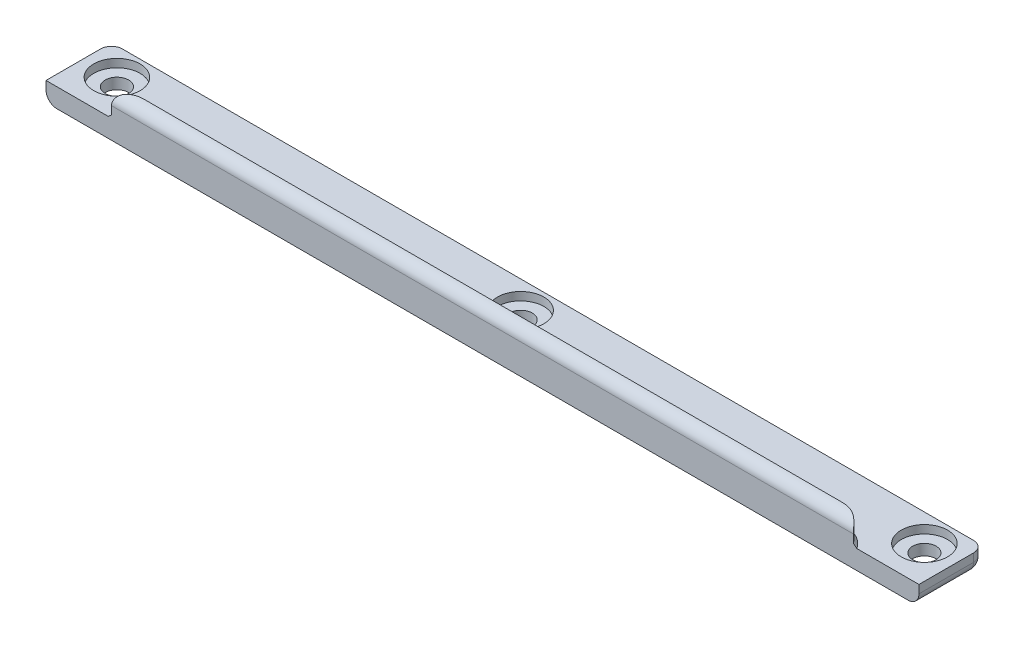
ISO-10303-21;
HEADER;
FILE_DESCRIPTION(('STEP AP214'),'2;1');
FILE_NAME('part.step','',(''),(''),'','','');
FILE_SCHEMA(('AUTOMOTIVE_DESIGN { 1 0 10303 214 1 1 1 1 }'));
ENDSEC;
DATA;
#1=APPLICATION_CONTEXT('core data for automotive mechanical design processes');
#2=APPLICATION_PROTOCOL_DEFINITION('international standard','automotive_design',2000,#1);
#3=PRODUCT_CONTEXT('',#1,'mechanical');
#4=PRODUCT('Part','Part','',(#3));
#5=PRODUCT_RELATED_PRODUCT_CATEGORY('part','',(#4));
#6=PRODUCT_DEFINITION_FORMATION('','',#4);
#7=PRODUCT_DEFINITION_CONTEXT('part definition',#1,'design');
#8=PRODUCT_DEFINITION('design','',#6,#7);
#9=PRODUCT_DEFINITION_SHAPE('','',#8);
#10=(LENGTH_UNIT() NAMED_UNIT(*) SI_UNIT(.MILLI.,.METRE.));
#11=(NAMED_UNIT(*) PLANE_ANGLE_UNIT() SI_UNIT($,.RADIAN.));
#12=(NAMED_UNIT(*) SI_UNIT($,.STERADIAN.) SOLID_ANGLE_UNIT());
#13=UNCERTAINTY_MEASURE_WITH_UNIT(LENGTH_MEASURE(1.E-05),#10,'distance_accuracy_value','');
#14=(GEOMETRIC_REPRESENTATION_CONTEXT(3) GLOBAL_UNCERTAINTY_ASSIGNED_CONTEXT((#13)) GLOBAL_UNIT_ASSIGNED_CONTEXT((#10,
#11,#12)) REPRESENTATION_CONTEXT('',''));
#15=CARTESIAN_POINT('',(0.,0.,0.));
#16=DIRECTION('',(0.,0.,1.));
#17=DIRECTION('',(1.,0.,0.));
#18=AXIS2_PLACEMENT_3D('',#15,#16,#17);
#19=CARTESIAN_POINT('',(0.,1.5,0.));
#20=DIRECTION('',(0.,-1.,0.));
#21=DIRECTION('',(0.,0.,-1.));
#22=AXIS2_PLACEMENT_3D('',#19,#20,#21);
#23=PLANE('',#22);
#24=DIRECTION('',(0.,0.,1.));
#25=VECTOR('',#24,1.);
#26=CARTESIAN_POINT('',(165.,1.5,5.));
#27=LINE('',#26,#25);
#28=CARTESIAN_POINT('',(165.,1.5,2.));
#29=VERTEX_POINT('',#28);
#30=CARTESIAN_POINT('',(165.,1.49999999999992,12.));
#31=VERTEX_POINT('',#30);
#32=EDGE_CURVE('E443',#29,#31,#27,.T.);
#33=ORIENTED_EDGE('',*,*,#32,.F.);
#34=CARTESIAN_POINT('',(163.,1.5,2.));
#35=DIRECTION('',(0.,-1.,0.));
#36=DIRECTION('',(0.,0.,-1.));
#37=AXIS2_PLACEMENT_3D('',#34,#35,#36);
#38=CIRCLE('',#37,2.);
#39=CARTESIAN_POINT('',(163.,1.5,0.));
#40=VERTEX_POINT('',#39);
#41=EDGE_CURVE('E12',#29,#40,#38,.F.);
#42=ORIENTED_EDGE('',*,*,#41,.T.);
#43=DIRECTION('',(-1.,0.,0.));
#44=VECTOR('',#43,1.);
#45=CARTESIAN_POINT('',(0.,1.5,0.));
#46=LINE('',#45,#44);
#47=CARTESIAN_POINT('',(7.,1.5,0.));
#48=VERTEX_POINT('',#47);
#49=EDGE_CURVE('E242',#40,#48,#46,.T.);
#50=ORIENTED_EDGE('',*,*,#49,.T.);
#51=CARTESIAN_POINT('',(7.,1.5,2.));
#52=DIRECTION('',(0.,-1.,0.));
#53=DIRECTION('',(0.,0.,-1.));
#54=AXIS2_PLACEMENT_3D('',#51,#52,#53);
#55=CIRCLE('',#54,2.);
#56=CARTESIAN_POINT('',(5.,1.5,2.));
#57=VERTEX_POINT('',#56);
#58=EDGE_CURVE('E58',#48,#57,#55,.F.);
#59=ORIENTED_EDGE('',*,*,#58,.T.);
#60=DIRECTION('',(0.,0.,-1.));
#61=VECTOR('',#60,1.);
#62=CARTESIAN_POINT('',(5.,1.5,5.00000000000001));
#63=LINE('',#62,#61);
#64=CARTESIAN_POINT('',(5.,1.49999999999991,12.));
#65=VERTEX_POINT('',#64);
#66=EDGE_CURVE('E449',#65,#57,#63,.T.);
#67=ORIENTED_EDGE('',*,*,#66,.F.);
#68=DIRECTION('',(1.,0.,0.));
#69=VECTOR('',#68,1.);
#70=CARTESIAN_POINT('',(85.,1.49999999999991,12.));
#71=LINE('',#70,#69);
#72=CARTESIAN_POINT('',(16.3902277713536,1.49999999999991,12.));
#73=VERTEX_POINT('',#72);
#74=EDGE_CURVE('E241',#65,#73,#71,.T.);
#75=ORIENTED_EDGE('',*,*,#74,.T.);
#76=CARTESIAN_POINT('',(21.0000000000001,1.4999999999999,15.));
#77=DIRECTION('',(0.,-1.,0.));
#78=DIRECTION('',(1.,0.,0.));
#79=AXIS2_PLACEMENT_3D('',#76,#77,#78);
#80=CIRCLE('',#79,5.49999999999998);
#81=CARTESIAN_POINT('',(18.7087121525222,1.49999999999992,10.));
#82=VERTEX_POINT('',#81);
#83=EDGE_CURVE('E182',#82,#73,#80,.F.);
#84=ORIENTED_EDGE('',*,*,#83,.F.);
#85=DIRECTION('',(1.,0.,0.));
#86=VECTOR('',#85,1.);
#87=CARTESIAN_POINT('',(170.,1.5,10.));
#88=LINE('',#87,#86);
#89=CARTESIAN_POINT('',(151.291287847478,1.49999999999992,10.));
#90=VERTEX_POINT('',#89);
#91=EDGE_CURVE('E478',#82,#90,#88,.T.);
#92=ORIENTED_EDGE('',*,*,#91,.T.);
#93=CARTESIAN_POINT('',(149.,1.49999999999991,15.));
#94=DIRECTION('',(0.,-1.,0.));
#95=DIRECTION('',(1.,0.,0.));
#96=AXIS2_PLACEMENT_3D('',#93,#94,#95);
#97=CIRCLE('',#96,5.49999999999995);
#98=CARTESIAN_POINT('',(153.609772228646,1.49999999999992,12.));
#99=VERTEX_POINT('',#98);
#100=EDGE_CURVE('E158',#99,#90,#97,.F.);
#101=ORIENTED_EDGE('',*,*,#100,.F.);
#102=EDGE_CURVE('E260',#99,#31,#71,.T.);
#103=ORIENTED_EDGE('',*,*,#102,.T.);
#104=EDGE_LOOP('',(#33,#42,#50,#59,#67,#75,#84,#92,#101,#103));
#105=FACE_BOUND('',#104,.T.);
#106=CARTESIAN_POINT('',(159.,1.5,4.99999999999999));
#107=DIRECTION('',(0.,1.,0.));
#108=DIRECTION('',(0.,0.,1.));
#109=AXIS2_PLACEMENT_3D('',#106,#107,#108);
#110=CIRCLE('',#109,4.25000000000001);
#111=CARTESIAN_POINT('',(159.,1.5,9.25));
#112=VERTEX_POINT('',#111);
#113=EDGE_CURVE('E458',#112,#112,#110,.T.);
#114=ORIENTED_EDGE('',*,*,#113,.F.);
#115=EDGE_LOOP('',(#114));
#116=FACE_BOUND('',#115,.T.);
#117=CARTESIAN_POINT('',(11.,1.5,5.));
#118=DIRECTION('',(0.,1.,0.));
#119=DIRECTION('',(0.,0.,1.));
#120=AXIS2_PLACEMENT_3D('',#117,#118,#119);
#121=CIRCLE('',#120,4.25);
#122=CARTESIAN_POINT('',(11.,1.5,9.25000000000001));
#123=VERTEX_POINT('',#122);
#124=EDGE_CURVE('E466',#123,#123,#121,.T.);
#125=ORIENTED_EDGE('',*,*,#124,.F.);
#126=EDGE_LOOP('',(#125));
#127=FACE_BOUND('',#126,.T.);
#128=CARTESIAN_POINT('',(85.,1.5,5.00000000000001));
#129=DIRECTION('',(0.,1.,0.));
#130=DIRECTION('',(0.,0.,1.));
#131=AXIS2_PLACEMENT_3D('',#128,#129,#130);
#132=CIRCLE('',#131,4.25000000000001);
#133=CARTESIAN_POINT('',(85.,1.5,9.25000000000001));
#134=VERTEX_POINT('',#133);
#135=EDGE_CURVE('E474',#134,#134,#132,.T.);
#136=ORIENTED_EDGE('',*,*,#135,.F.);
#137=EDGE_LOOP('',(#136));
#138=FACE_BOUND('',#137,.T.);
#139=ADVANCED_FACE('F47',(#105,#116,#127,#138),#23,.F.);
#140=CARTESIAN_POINT('',(0.,1.5,0.));
#141=DIRECTION('',(0.,0.,1.));
#142=DIRECTION('',(1.,0.,0.));
#143=AXIS2_PLACEMENT_3D('',#140,#141,#142);
#144=PLANE('',#143);
#145=ORIENTED_EDGE('',*,*,#49,.F.);
#146=DIRECTION('',(0.,1.,0.));
#147=VECTOR('',#146,1.);
#148=CARTESIAN_POINT('',(163.,1.5,0.));
#149=LINE('',#148,#147);
#150=CARTESIAN_POINT('',(163.,0.,0.));
#151=VERTEX_POINT('',#150);
#152=EDGE_CURVE('E292',#40,#151,#149,.F.);
#153=ORIENTED_EDGE('',*,*,#152,.T.);
#154=DIRECTION('',(1.,0.,0.));
#155=VECTOR('',#154,1.);
#156=CARTESIAN_POINT('',(0.,0.,0.));
#157=LINE('',#156,#155);
#158=CARTESIAN_POINT('',(7.,0.,0.));
#159=VERTEX_POINT('',#158);
#160=EDGE_CURVE('E289',#151,#159,#157,.F.);
#161=ORIENTED_EDGE('',*,*,#160,.T.);
#162=DIRECTION('',(0.,1.,0.));
#163=VECTOR('',#162,1.);
#164=CARTESIAN_POINT('',(7.,1.5,0.));
#165=LINE('',#164,#163);
#166=EDGE_CURVE('E286',#159,#48,#165,.T.);
#167=ORIENTED_EDGE('',*,*,#166,.T.);
#168=EDGE_LOOP('',(#145,#153,#161,#167));
#169=FACE_BOUND('',#168,.T.);
#170=ADVANCED_FACE('F332',(#169),#144,.F.);
#171=CARTESIAN_POINT('',(85.,1.5,5.00000000000001));
#172=DIRECTION('',(0.,-1.,0.));
#173=DIRECTION('',(0.,0.,-1.));
#174=AXIS2_PLACEMENT_3D('',#171,#172,#173);
#175=CYLINDRICAL_SURFACE('',#174,4.25000000000001);
#176=ORIENTED_EDGE('',*,*,#135,.T.);
#177=EDGE_LOOP('',(#176));
#178=FACE_BOUND('',#177,.T.);
#179=CARTESIAN_POINT('',(85.,0.,5.00000000000001));
#180=DIRECTION('',(0.,1.,0.));
#181=DIRECTION('',(0.,0.,1.));
#182=AXIS2_PLACEMENT_3D('',#179,#180,#181);
#183=CIRCLE('',#182,4.25000000000001);
#184=CARTESIAN_POINT('',(85.,0.,9.25000000000001));
#185=VERTEX_POINT('',#184);
#186=EDGE_CURVE('E470',#185,#185,#183,.T.);
#187=ORIENTED_EDGE('',*,*,#186,.F.);
#188=EDGE_LOOP('',(#187));
#189=FACE_BOUND('',#188,.T.);
#190=ADVANCED_FACE('F338',(#178,#189),#175,.F.);
#191=CARTESIAN_POINT('',(11.,1.5,5.));
#192=DIRECTION('',(0.,-1.,0.));
#193=DIRECTION('',(0.,0.,-1.));
#194=AXIS2_PLACEMENT_3D('',#191,#192,#193);
#195=CYLINDRICAL_SURFACE('',#194,4.25);
#196=ORIENTED_EDGE('',*,*,#124,.T.);
#197=EDGE_LOOP('',(#196));
#198=FACE_BOUND('',#197,.T.);
#199=CARTESIAN_POINT('',(11.,0.,5.));
#200=DIRECTION('',(0.,1.,0.));
#201=DIRECTION('',(0.,0.,1.));
#202=AXIS2_PLACEMENT_3D('',#199,#200,#201);
#203=CIRCLE('',#202,4.25);
#204=CARTESIAN_POINT('',(11.,0.,9.25000000000001));
#205=VERTEX_POINT('',#204);
#206=EDGE_CURVE('E462',#205,#205,#203,.T.);
#207=ORIENTED_EDGE('',*,*,#206,.F.);
#208=EDGE_LOOP('',(#207));
#209=FACE_BOUND('',#208,.T.);
#210=ADVANCED_FACE('F650',(#198,#209),#195,.F.);
#211=CARTESIAN_POINT('',(159.,1.5,4.99999999999999));
#212=DIRECTION('',(0.,-1.,0.));
#213=DIRECTION('',(0.,0.,-1.));
#214=AXIS2_PLACEMENT_3D('',#211,#212,#213);
#215=CYLINDRICAL_SURFACE('',#214,4.25000000000001);
#216=ORIENTED_EDGE('',*,*,#113,.T.);
#217=EDGE_LOOP('',(#216));
#218=FACE_BOUND('',#217,.T.);
#219=CARTESIAN_POINT('',(159.,0.,4.99999999999999));
#220=DIRECTION('',(0.,1.,0.));
#221=DIRECTION('',(0.,0.,1.));
#222=AXIS2_PLACEMENT_3D('',#219,#220,#221);
#223=CIRCLE('',#222,4.25000000000001);
#224=CARTESIAN_POINT('',(159.,0.,9.25));
#225=VERTEX_POINT('',#224);
#226=EDGE_CURVE('E455',#225,#225,#223,.T.);
#227=ORIENTED_EDGE('',*,*,#226,.F.);
#228=EDGE_LOOP('',(#227));
#229=FACE_BOUND('',#228,.T.);
#230=ADVANCED_FACE('F515',(#218,#229),#215,.F.);
#231=CARTESIAN_POINT('',(0.,0.,0.));
#232=DIRECTION('',(0.,1.,0.));
#233=DIRECTION('',(0.,0.,1.));
#234=AXIS2_PLACEMENT_3D('',#231,#232,#233);
#235=PLANE('',#234);
#236=CARTESIAN_POINT('',(159.,0.,4.99999999999999));
#237=DIRECTION('',(0.,1.,0.));
#238=DIRECTION('',(0.,0.,1.));
#239=AXIS2_PLACEMENT_3D('',#236,#237,#238);
#240=CIRCLE('',#239,2.15000000000002);
#241=CARTESIAN_POINT('',(159.,0.,7.15000000000001));
#242=VERTEX_POINT('',#241);
#243=EDGE_CURVE('E745',#242,#242,#240,.T.);
#244=ORIENTED_EDGE('',*,*,#243,.F.);
#245=EDGE_LOOP('',(#244));
#246=FACE_BOUND('',#245,.T.);
#247=ORIENTED_EDGE('',*,*,#226,.T.);
#248=EDGE_LOOP('',(#247));
#249=FACE_BOUND('',#248,.T.);
#250=ADVANCED_FACE('F510',(#246,#249),#235,.T.);
#251=CARTESIAN_POINT('',(85.,0.,5.00000000000001));
#252=DIRECTION('',(0.,1.,0.));
#253=DIRECTION('',(0.,0.,1.));
#254=AXIS2_PLACEMENT_3D('',#251,#252,#253);
#255=CIRCLE('',#254,2.15);
#256=CARTESIAN_POINT('',(85.,0.,7.15000000000001));
#257=VERTEX_POINT('',#256);
#258=EDGE_CURVE('E406',#257,#257,#255,.T.);
#259=ORIENTED_EDGE('',*,*,#258,.F.);
#260=EDGE_LOOP('',(#259));
#261=FACE_BOUND('',#260,.T.);
#262=ORIENTED_EDGE('',*,*,#186,.T.);
#263=EDGE_LOOP('',(#262));
#264=FACE_BOUND('',#263,.T.);
#265=ADVANCED_FACE('F514',(#261,#264),#235,.T.);
#266=CARTESIAN_POINT('',(11.,0.,5.));
#267=DIRECTION('',(0.,1.,0.));
#268=DIRECTION('',(0.,0.,1.));
#269=AXIS2_PLACEMENT_3D('',#266,#267,#268);
#270=CIRCLE('',#269,2.15);
#271=CARTESIAN_POINT('',(11.,0.,7.15));
#272=VERTEX_POINT('',#271);
#273=EDGE_CURVE('E743',#272,#272,#270,.T.);
#274=ORIENTED_EDGE('',*,*,#273,.F.);
#275=EDGE_LOOP('',(#274));
#276=FACE_BOUND('',#275,.T.);
#277=ORIENTED_EDGE('',*,*,#206,.T.);
#278=EDGE_LOOP('',(#277));
#279=FACE_BOUND('',#278,.T.);
#280=ADVANCED_FACE('F419',(#276,#279),#235,.T.);
#281=CARTESIAN_POINT('',(0.,-2.,0.));
#282=DIRECTION('',(0.,1.,0.));
#283=DIRECTION('',(0.,0.,1.));
#284=AXIS2_PLACEMENT_3D('',#281,#282,#283);
#285=PLANE('',#284);
#286=CARTESIAN_POINT('',(11.,-2.,5.));
#287=DIRECTION('',(0.,1.,0.));
#288=DIRECTION('',(0.,0.,1.));
#289=AXIS2_PLACEMENT_3D('',#286,#287,#288);
#290=CIRCLE('',#289,2.15);
#291=CARTESIAN_POINT('',(11.,-2.,7.15));
#292=VERTEX_POINT('',#291);
#293=EDGE_CURVE('E52',#292,#292,#290,.T.);
#294=ORIENTED_EDGE('',*,*,#293,.T.);
#295=EDGE_LOOP('',(#294));
#296=FACE_BOUND('',#295,.T.);
#297=CARTESIAN_POINT('',(159.,-2.,4.99999999999999));
#298=DIRECTION('',(0.,1.,0.));
#299=DIRECTION('',(0.,0.,1.));
#300=AXIS2_PLACEMENT_3D('',#297,#298,#299);
#301=CIRCLE('',#300,2.15000000000002);
#302=CARTESIAN_POINT('',(159.,-2.,7.15000000000001));
#303=VERTEX_POINT('',#302);
#304=EDGE_CURVE('E405',#303,#303,#301,.T.);
#305=ORIENTED_EDGE('',*,*,#304,.T.);
#306=EDGE_LOOP('',(#305));
#307=FACE_BOUND('',#306,.T.);
#308=CARTESIAN_POINT('',(85.,-2.,5.00000000000001));
#309=DIRECTION('',(0.,1.,0.));
#310=DIRECTION('',(0.,0.,1.));
#311=AXIS2_PLACEMENT_3D('',#308,#309,#310);
#312=CIRCLE('',#311,2.15);
#313=CARTESIAN_POINT('',(85.,-2.,7.15000000000001));
#314=VERTEX_POINT('',#313);
#315=EDGE_CURVE('E402',#314,#314,#312,.T.);
#316=ORIENTED_EDGE('',*,*,#315,.T.);
#317=EDGE_LOOP('',(#316));
#318=FACE_BOUND('',#317,.T.);
#319=DIRECTION('',(1.,0.,0.));
#320=VECTOR('',#319,1.);
#321=CARTESIAN_POINT('',(0.,-2.,2.));
#322=LINE('',#321,#320);
#323=CARTESIAN_POINT('',(7.,-2.,2.));
#324=VERTEX_POINT('',#323);
#325=CARTESIAN_POINT('',(163.,-2.,2.));
#326=VERTEX_POINT('',#325);
#327=EDGE_CURVE('E264',#324,#326,#322,.T.);
#328=ORIENTED_EDGE('',*,*,#327,.T.);
#329=DIRECTION('',(0.,0.,1.));
#330=VECTOR('',#329,1.);
#331=CARTESIAN_POINT('',(163.,-2.,0.));
#332=LINE('',#331,#330);
#333=CARTESIAN_POINT('',(163.,-2.,12.));
#334=VERTEX_POINT('',#333);
#335=EDGE_CURVE('E267',#326,#334,#332,.T.);
#336=ORIENTED_EDGE('',*,*,#335,.T.);
#337=DIRECTION('',(1.,0.,0.));
#338=VECTOR('',#337,1.);
#339=CARTESIAN_POINT('',(85.,-2.,12.));
#340=LINE('',#339,#338);
#341=CARTESIAN_POINT('',(6.99999999999999,-2.,12.));
#342=VERTEX_POINT('',#341);
#343=EDGE_CURVE('E440',#342,#334,#340,.T.);
#344=ORIENTED_EDGE('',*,*,#343,.F.);
#345=DIRECTION('',(0.,0.,-1.));
#346=VECTOR('',#345,1.);
#347=CARTESIAN_POINT('',(7.,-2.,0.));
#348=LINE('',#347,#346);
#349=EDGE_CURVE('E261',#342,#324,#348,.T.);
#350=ORIENTED_EDGE('',*,*,#349,.T.);
#351=EDGE_LOOP('',(#328,#336,#344,#350));
#352=FACE_BOUND('',#351,.T.);
#353=ADVANCED_FACE('F415',(#296,#307,#318,#352),#285,.F.);
#354=CARTESIAN_POINT('',(5.,-3.5,5.00000000000001));
#355=DIRECTION('',(1.,0.,0.));
#356=DIRECTION('',(0.,0.,-1.));
#357=AXIS2_PLACEMENT_3D('',#354,#355,#356);
#358=PLANE('',#357);
#359=DIRECTION('',(0.,1.,0.));
#360=VECTOR('',#359,1.);
#361=CARTESIAN_POINT('',(5.,-3.5,2.));
#362=LINE('',#361,#360);
#363=CARTESIAN_POINT('',(5.,0.,2.));
#364=VERTEX_POINT('',#363);
#365=EDGE_CURVE('E66',#57,#364,#362,.F.);
#366=ORIENTED_EDGE('',*,*,#365,.T.);
#367=DIRECTION('',(0.,0.,-1.));
#368=VECTOR('',#367,1.);
#369=CARTESIAN_POINT('',(5.,0.,5.00000000000001));
#370=LINE('',#369,#368);
#371=CARTESIAN_POINT('',(5.,0.,12.));
#372=VERTEX_POINT('',#371);
#373=EDGE_CURVE('E297',#364,#372,#370,.F.);
#374=ORIENTED_EDGE('',*,*,#373,.T.);
#375=DIRECTION('',(0.,1.,0.));
#376=VECTOR('',#375,1.);
#377=CARTESIAN_POINT('',(5.,-2.,12.));
#378=LINE('',#377,#376);
#379=EDGE_CURVE('E445',#372,#65,#378,.T.);
#380=ORIENTED_EDGE('',*,*,#379,.T.);
#381=ORIENTED_EDGE('',*,*,#66,.T.);
#382=EDGE_LOOP('',(#366,#374,#380,#381));
#383=FACE_BOUND('',#382,.T.);
#384=ADVANCED_FACE('F418',(#383),#358,.F.);
#385=CARTESIAN_POINT('',(165.,-3.5,5.));
#386=DIRECTION('',(-1.,0.,0.));
#387=DIRECTION('',(0.,0.,1.));
#388=AXIS2_PLACEMENT_3D('',#385,#386,#387);
#389=PLANE('',#388);
#390=DIRECTION('',(0.,1.,0.));
#391=VECTOR('',#390,1.);
#392=CARTESIAN_POINT('',(165.,-2.,12.));
#393=LINE('',#392,#391);
#394=CARTESIAN_POINT('',(165.,0.,12.));
#395=VERTEX_POINT('',#394);
#396=EDGE_CURVE('E438',#395,#31,#393,.T.);
#397=ORIENTED_EDGE('',*,*,#396,.F.);
#398=DIRECTION('',(0.,0.,1.));
#399=VECTOR('',#398,1.);
#400=CARTESIAN_POINT('',(165.,0.,5.));
#401=LINE('',#400,#399);
#402=CARTESIAN_POINT('',(165.,0.,2.));
#403=VERTEX_POINT('',#402);
#404=EDGE_CURVE('E283',#395,#403,#401,.F.);
#405=ORIENTED_EDGE('',*,*,#404,.T.);
#406=DIRECTION('',(0.,1.,0.));
#407=VECTOR('',#406,1.);
#408=CARTESIAN_POINT('',(165.,-3.5,2.));
#409=LINE('',#408,#407);
#410=EDGE_CURVE('E280',#403,#29,#409,.T.);
#411=ORIENTED_EDGE('',*,*,#410,.T.);
#412=ORIENTED_EDGE('',*,*,#32,.T.);
#413=EDGE_LOOP('',(#397,#405,#411,#412));
#414=FACE_BOUND('',#413,.T.);
#415=ADVANCED_FACE('F250',(#414),#389,.F.);
#416=CARTESIAN_POINT('',(165.,-2.,10.));
#417=DIRECTION('',(0.,0.,-1.));
#418=DIRECTION('',(-1.,0.,0.));
#419=AXIS2_PLACEMENT_3D('',#416,#417,#418);
#420=PLANE('',#419);
#421=CARTESIAN_POINT('',(158.823639585547,-4.02288050859359,10.));
#422=CARTESIAN_POINT('',(158.679187008618,-3.89414668142362,10.));
#423=CARTESIAN_POINT('',(158.534447425348,-3.76573489948347,10.));
#424=CARTESIAN_POINT('',(158.244315009627,-3.50964802512456,10.));
#425=CARTESIAN_POINT('',(158.098922169238,-3.38197294169994,10.));
#426=CARTESIAN_POINT('',(157.661538462106,-3.00009878503038,10.));
#427=CARTESIAN_POINT('',(157.368453022963,-2.74714963308837,10.));
#428=CARTESIAN_POINT('',(156.774166656824,-2.24190415398258,10.));
#429=CARTESIAN_POINT('',(156.472909851035,-1.98967336118651,10.));
#430=CARTESIAN_POINT('',(155.865422368053,-1.49139556425322,10.));
#431=CARTESIAN_POINT('',(155.559192827432,-1.24534717891882,10.));
#432=CARTESIAN_POINT('',(154.954031907989,-0.772790335356749,10.));
#433=CARTESIAN_POINT('',(154.65539991964,-0.545901846651889,10.));
#434=CARTESIAN_POINT('',(154.201141523399,-0.213963823931691,10.));
#435=CARTESIAN_POINT('',(154.048612192514,-0.104677699996015,10.));
#436=CARTESIAN_POINT('',(153.741131763376,0.110425782709302,10.));
#437=CARTESIAN_POINT('',(153.586180805783,0.216243341852682,10.));
#438=CARTESIAN_POINT('',(153.274068330244,0.423217203340243,10.));
#439=CARTESIAN_POINT('',(153.116917983078,0.524390290501957,10.));
#440=CARTESIAN_POINT('',(152.799333841285,0.721510645107517,10.));
#441=CARTESIAN_POINT('',(152.638899698933,0.817457355142617,10.));
#442=CARTESIAN_POINT('',(152.314453356558,1.00267734604393,10.));
#443=CARTESIAN_POINT('',(152.15044561537,1.09195838968651,10.));
#444=CARTESIAN_POINT('',(151.818210100286,1.26223330653509,10.));
#445=CARTESIAN_POINT('',(151.649983698766,1.34322983233147,10.));
#446=CARTESIAN_POINT('',(151.323637265913,1.48821038477102,10.));
#447=CARTESIAN_POINT('',(151.16590514607,1.55306048993231,10.));
#448=CARTESIAN_POINT('',(150.846398091382,1.67203453296224,10.));
#449=CARTESIAN_POINT('',(150.684623179059,1.7261585305696,10.));
#450=CARTESIAN_POINT('',(150.358070640502,1.82118703198331,10.));
#451=CARTESIAN_POINT('',(150.193312398414,1.86215717276911,10.));
#452=CARTESIAN_POINT('',(149.860742988858,1.92906505883743,10.));
#453=CARTESIAN_POINT('',(149.692932270096,1.95500499538921,10.));
#454=CARTESIAN_POINT('',(149.353304663584,1.99041358072344,10.));
#455=CARTESIAN_POINT('',(149.181464130251,1.99966043046035,10.));
#456=CARTESIAN_POINT('',(148.837753669801,2.00032110336199,10.));
#457=CARTESIAN_POINT('',(148.665883743509,1.99173536480297,10.));
#458=CARTESIAN_POINT('',(148.323302112538,1.95730723248824,10.));
#459=CARTESIAN_POINT('',(148.152596632906,1.93140406691528,10.));
#460=CARTESIAN_POINT('',(147.814313510164,1.86401586607333,10.));
#461=CARTESIAN_POINT('',(147.646736649736,1.82252698515852,10.));
#462=CARTESIAN_POINT('',(147.250864652945,1.70746636131237,10.));
#463=CARTESIAN_POINT('',(147.024384315048,1.62769278713539,10.));
#464=CARTESIAN_POINT('',(146.579323952193,1.44859992869065,10.));
#465=CARTESIAN_POINT('',(146.360749672862,1.34926675463115,10.));
#466=CARTESIAN_POINT('',(145.929939343044,1.13568954771588,10.));
#467=CARTESIAN_POINT('',(145.717734499686,1.02138338660052,10.));
#468=CARTESIAN_POINT('',(145.299638884565,0.78201567634305,10.));
#469=CARTESIAN_POINT('',(145.093746224681,0.656957386845967,10.));
#470=CARTESIAN_POINT('',(144.647328401208,0.373505737062337,10.));
#471=CARTESIAN_POINT('',(144.407910131952,0.213377940413848,10.));
#472=CARTESIAN_POINT('',(144.05437111291,-0.032226756182669,10.));
#473=CARTESIAN_POINT('',(143.938038337841,-0.114561598963869,10.));
#474=CARTESIAN_POINT('',(143.706656820765,-0.281005022592318,10.));
#475=CARTESIAN_POINT('',(143.591608012808,-0.365113511691081,10.));
#476=CARTESIAN_POINT('',(143.477119491406,-0.449980477303671,10.));
#477=B_SPLINE_CURVE_WITH_KNOTS('',3,(#421,#422,#423,#424,#425,#426,#427,#428,#429,#430,#431,
#432,#433,#434,#435,#436,#437,#438,#439,#440,#441,#442,#443,#444,#445,#446,#447,#448,#449,#450,
#451,#452,#453,#454,#455,#456,#457,#458,#459,#460,#461,#462,#463,#464,#465,#466,#467,#468,#469,
#470,#471,#472,#473,#474,#475,#476),.UNSPECIFIED.,.F.,.F.,(4,2,2,2,2,2,2,2,2,2,2,2,2,2,2,2,2,2,
2,2,2,2,2,2,2,2,2,4),(0.,0.580473568099085,1.16095420810336,2.32236045991458,3.50102197606723,
4.67941778582729,5.80434092813244,6.36722298416798,6.93007246584584,7.49069517902172,
8.05137756768464,8.61139646155422,9.17123547991948,9.6825483676921,10.1938584076439,
10.7025758878699,11.2112191829662,11.7265723675733,12.2419128863588,12.7590714426592,
13.2763576874414,13.9954334901485,14.7150217813054,15.4376965336299,16.1601529652291,
17.0239799281097,17.4515329247179,17.8790638585405),.UNSPECIFIED.);
#478=CARTESIAN_POINT('',(149.,1.9999999999999,10.));
#479=VERTEX_POINT('',#478);
#480=EDGE_CURVE('E152',#90,#479,#477,.T.);
#481=ORIENTED_EDGE('',*,*,#480,.F.);
#482=ORIENTED_EDGE('',*,*,#91,.F.);
#483=CARTESIAN_POINT('',(26.5228805085937,-0.449980477303575,10.));
#484=CARTESIAN_POINT('',(26.3798870954563,-0.344004281673843,10.));
#485=CARTESIAN_POINT('',(26.2360226738314,-0.239180946539514,10.));
#486=CARTESIAN_POINT('',(25.9461931180467,-0.0323823290911828,10.));
#487=CARTESIAN_POINT('',(25.8002273149336,0.0695920144740185,10.));
#488=CARTESIAN_POINT('',(25.5044301869456,0.271101615819649,10.));
#489=CARTESIAN_POINT('',(25.3545746325248,0.370601448946087,10.));
#490=CARTESIAN_POINT('',(25.0520771441366,0.56525701434229,10.));
#491=CARTESIAN_POINT('',(24.8994354567401,0.660413128443903,10.));
#492=CARTESIAN_POINT('',(24.5827495630152,0.850269473467233,10.));
#493=CARTESIAN_POINT('',(24.4185296961294,0.944678464427429,10.));
#494=CARTESIAN_POINT('',(24.0859426438371,1.12602313130937,10.));
#495=CARTESIAN_POINT('',(23.9175746666962,1.21295736611053,10.));
#496=CARTESIAN_POINT('',(23.5769016484752,1.37699138066317,10.));
#497=CARTESIAN_POINT('',(23.4046150858232,1.45412917002558,10.));
#498=CARTESIAN_POINT('',(23.0552161281562,1.59643730915864,10.));
#499=CARTESIAN_POINT('',(22.8781065707652,1.66161452843549,10.));
#500=CARTESIAN_POINT('',(22.5301546992681,1.77353191114616,10.));
#501=CARTESIAN_POINT('',(22.3596029896276,1.82116354967251,10.));
#502=CARTESIAN_POINT('',(22.0148131861101,1.90080881099644,10.));
#503=CARTESIAN_POINT('',(21.8405749239058,1.93282171903295,10.));
#504=CARTESIAN_POINT('',(21.4926853651786,1.97869111402608,10.));
#505=CARTESIAN_POINT('',(21.3190742074119,1.99284624712955,10.));
#506=CARTESIAN_POINT('',(20.9713200822554,2.0029381993081,10.));
#507=CARTESIAN_POINT('',(20.7971771445955,1.9988760188643,10.));
#508=CARTESIAN_POINT('',(20.4499450159212,1.97282278601951,10.));
#509=CARTESIAN_POINT('',(20.2768583512732,1.95079878050919,10.));
#510=CARTESIAN_POINT('',(19.933600483416,1.89034018258271,10.));
#511=CARTESIAN_POINT('',(19.7634298310925,1.85190252412861,10.));
#512=CARTESIAN_POINT('',(19.4253527158623,1.76046345686142,10.));
#513=CARTESIAN_POINT('',(19.2574837598823,1.70732555917013,10.));
#514=CARTESIAN_POINT('',(18.9260580968998,1.58915386380797,10.));
#515=CARTESIAN_POINT('',(18.7625012044167,1.52412057876761,10.));
#516=CARTESIAN_POINT('',(18.3810600312668,1.35912719917081,10.));
#517=CARTESIAN_POINT('',(18.1649676692677,1.25505062292228,10.));
#518=CARTESIAN_POINT('',(17.7396114400765,1.03366610787057,10.));
#519=CARTESIAN_POINT('',(17.5303521965691,0.916349439836651,10.));
#520=CARTESIAN_POINT('',(17.1172149169493,0.671629399979496,10.));
#521=CARTESIAN_POINT('',(16.9133503555507,0.544203462955177,10.));
#522=CARTESIAN_POINT('',(16.5105313911075,0.281966255712366,10.));
#523=CARTESIAN_POINT('',(16.3115758438633,0.147156730513696,10.));
#524=CARTESIAN_POINT('',(15.9166444567891,-0.128847547925202,10.));
#525=CARTESIAN_POINT('',(15.7206890930605,-0.270071464069986,10.));
#526=CARTESIAN_POINT('',(15.3320802429382,-0.556993626872332,10.));
#527=CARTESIAN_POINT('',(15.1394269086388,-0.702692078772461,10.));
#528=CARTESIAN_POINT('',(14.7570995207627,-0.99743761585011,10.));
#529=CARTESIAN_POINT('',(14.5674219680358,-1.14648017409739,10.));
#530=CARTESIAN_POINT('',(14.1903404497916,-1.44739990808509,10.));
#531=CARTESIAN_POINT('',(14.0029364354375,-1.59927702275912,10.));
#532=CARTESIAN_POINT('',(13.5908277840103,-1.93751636779831,10.));
#533=CARTESIAN_POINT('',(13.3665644575927,-2.12441566756489,10.));
#534=CARTESIAN_POINT('',(12.920250510704,-2.50094832491506,10.));
#535=CARTESIAN_POINT('',(12.6982004758737,-2.69058237525787,10.));
#536=CARTESIAN_POINT('',(12.2586327521899,-3.0697195590069,10.));
#537=CARTESIAN_POINT('',(12.0410926818975,-3.25919678292802,10.));
#538=CARTESIAN_POINT('',(11.6076142947933,-3.63984519346286,10.));
#539=CARTESIAN_POINT('',(11.3916755174487,-3.83101585534422,10.));
#540=CARTESIAN_POINT('',(11.1763604144527,-4.02288050859363,10.));
#541=B_SPLINE_CURVE_WITH_KNOTS('',3,(#483,#484,#485,#486,#487,#488,#489,#490,#491,#492,#493,
#494,#495,#496,#497,#498,#499,#500,#501,#502,#503,#504,#505,#506,#507,#508,#509,#510,#511,#512,
#513,#514,#515,#516,#517,#518,#519,#520,#521,#522,#523,#524,#525,#526,#527,#528,#529,#530,#531,
#532,#533,#534,#535,#536,#537,#538,#539,#540),.UNSPECIFIED.,.F.,.F.,(4,2,2,2,2,2,2,2,2,2,2,2,2,
2,2,2,2,2,2,2,2,2,2,2,2,2,2,2,4),(0.,0.533963991868532,1.06810189915742,1.60768051380773,
2.14721160544483,2.71532682081483,3.28355132339372,3.84949902688469,4.4151206561915,
4.94573276035965,5.47636914469009,5.99800837641616,6.51961896045996,7.04218865975746,
7.56485601677243,8.09254927077605,8.62021978924774,9.33911500158335,10.0584869834407,
10.7795124951726,11.5003683306355,12.2249155943852,12.9494961421916,13.6731488438818,
14.3967859734825,15.2725601446629,16.1485602035097,17.0140139979156,17.8792084000731),.UNSPECIFIED.);
#542=CARTESIAN_POINT('',(21.0000000000001,1.99999999999989,10.));
#543=VERTEX_POINT('',#542);
#544=EDGE_CURVE('E165',#543,#82,#541,.T.);
#545=ORIENTED_EDGE('',*,*,#544,.F.);
#546=DIRECTION('',(0.,-1.,0.));
#547=VECTOR('',#546,1.);
#548=CARTESIAN_POINT('',(21.0000000000001,1.49999999999992,10.));
#549=LINE('',#548,#547);
#550=CARTESIAN_POINT('',(21.0000000000001,5.5,10.));
#551=VERTEX_POINT('',#550);
#552=EDGE_CURVE('E183',#551,#543,#549,.T.);
#553=ORIENTED_EDGE('',*,*,#552,.F.);
#554=DIRECTION('',(-1.,0.,0.));
#555=VECTOR('',#554,1.);
#556=CARTESIAN_POINT('',(165.,5.5,10.));
#557=LINE('',#556,#555);
#558=CARTESIAN_POINT('',(149.,5.5,10.));
#559=VERTEX_POINT('',#558);
#560=EDGE_CURVE('E164',#559,#551,#557,.T.);
#561=ORIENTED_EDGE('',*,*,#560,.F.);
#562=DIRECTION('',(0.,-1.,0.));
#563=VECTOR('',#562,1.);
#564=CARTESIAN_POINT('',(149.,13.4999999999999,10.0000000000001));
#565=LINE('',#564,#563);
#566=EDGE_CURVE('E170',#479,#559,#565,.F.);
#567=ORIENTED_EDGE('',*,*,#566,.F.);
#568=EDGE_LOOP('',(#481,#482,#545,#553,#561,#567));
#569=FACE_BOUND('',#568,.T.);
#570=ADVANCED_FACE('F178',(#569),#420,.T.);
#571=CARTESIAN_POINT('',(85.,-2.,12.));
#572=DIRECTION('',(0.,0.,1.));
#573=DIRECTION('',(1.,0.,0.));
#574=AXIS2_PLACEMENT_3D('',#571,#572,#573);
#575=PLANE('',#574);
#576=ORIENTED_EDGE('',*,*,#343,.T.);
#577=CARTESIAN_POINT('',(163.,0.,12.));
#578=DIRECTION('',(0.,0.,1.));
#579=DIRECTION('',(1.,0.,0.));
#580=AXIS2_PLACEMENT_3D('',#577,#578,#579);
#581=CIRCLE('',#580,2.);
#582=EDGE_CURVE('E277',#334,#395,#581,.T.);
#583=ORIENTED_EDGE('',*,*,#582,.T.);
#584=ORIENTED_EDGE('',*,*,#396,.T.);
#585=ORIENTED_EDGE('',*,*,#102,.F.);
#586=CARTESIAN_POINT('',(148.9993,3.99999991833331,12.));
#587=CARTESIAN_POINT('',(149.045447762095,4.00001440193328,12.));
#588=CARTESIAN_POINT('',(149.091588967729,3.99895610625918,12.));
#589=CARTESIAN_POINT('',(149.183767221705,3.99472879797045,12.));
#590=CARTESIAN_POINT('',(149.229804285922,3.99156013235575,12.));
#591=CARTESIAN_POINT('',(149.367439341317,3.97895917159307,12.));
#592=CARTESIAN_POINT('',(149.458768983753,3.96643164561178,12.));
#593=CARTESIAN_POINT('',(149.638380095417,3.93408198026754,12.));
#594=CARTESIAN_POINT('',(149.726686799072,3.9143964769034,12.));
#595=CARTESIAN_POINT('',(149.901633125983,3.868576438572,12.));
#596=CARTESIAN_POINT('',(149.98827192733,3.84243880760306,12.));
#597=CARTESIAN_POINT('',(150.261599912548,3.75032602743748,12.));
#598=CARTESIAN_POINT('',(150.444780416556,3.67393233170622,12.));
#599=CARTESIAN_POINT('',(150.802794660767,3.50355028020987,12.));
#600=CARTESIAN_POINT('',(150.977611941278,3.40952888605029,12.));
#601=CARTESIAN_POINT('',(151.323558468484,3.20805536580643,12.));
#602=CARTESIAN_POINT('',(151.494560583501,3.10038786171521,12.));
#603=CARTESIAN_POINT('',(151.830989809058,2.87705101826307,12.));
#604=CARTESIAN_POINT('',(151.996421154042,2.76138797041435,12.));
#605=CARTESIAN_POINT('',(152.28612875335,2.55127885262884,12.));
#606=CARTESIAN_POINT('',(152.411233829622,2.45796626858028,12.));
#607=CARTESIAN_POINT('',(152.6594564276,2.26870311551246,12.));
#608=CARTESIAN_POINT('',(152.782573664658,2.17275217391923,12.));
#609=CARTESIAN_POINT('',(153.023893774635,1.98138928477743,12.));
#610=CARTESIAN_POINT('',(153.142139946698,1.88603174807744,12.));
#611=CARTESIAN_POINT('',(153.377300457903,1.69375401438411,12.));
#612=CARTESIAN_POINT('',(153.494215163703,1.59683426626315,12.));
#613=CARTESIAN_POINT('',(153.610607388403,1.4992999999999,12.));
#614=B_SPLINE_CURVE_WITH_KNOTS('',3,(#586,#587,#588,#589,#590,#591,#592,#593,#594,#595,#596,
#597,#598,#599,#600,#601,#602,#603,#604,#605,#606,#607,#608,#609,#610,#611,#612,#613),
.UNSPECIFIED.,.F.,.F.,(4,2,2,2,2,2,2,2,2,2,2,2,2,4),(0.,0.138417904528293,0.276813055155032,
0.552982345383834,0.824135174625993,1.09541836815905,1.68922013599527,2.28414615778893,
2.89002385604988,3.49543011360572,3.96360790458916,4.43185215201817,4.88755354891626,
5.34312626352991),.UNSPECIFIED.);
#615=CARTESIAN_POINT('',(153.,1.99999999999989,12.));
#616=VERTEX_POINT('',#615);
#617=EDGE_CURVE('E253',#616,#99,#614,.T.);
#618=ORIENTED_EDGE('',*,*,#617,.F.);
#619=DIRECTION('',(0.,1.,0.));
#620=VECTOR('',#619,1.);
#621=CARTESIAN_POINT('',(153.,5.49999999999991,12.));
#622=LINE('',#621,#620);
#623=CARTESIAN_POINT('',(153.,3.5,12.));
#624=VERTEX_POINT('',#623);
#625=EDGE_CURVE('E173',#616,#624,#622,.T.);
#626=ORIENTED_EDGE('',*,*,#625,.T.);
#627=DIRECTION('',(1.,0.,0.));
#628=VECTOR('',#627,1.);
#629=CARTESIAN_POINT('',(17.0000000000001,3.5,12.));
#630=LINE('',#629,#628);
#631=CARTESIAN_POINT('',(17.0000000000001,3.5,12.));
#632=VERTEX_POINT('',#631);
#633=EDGE_CURVE('E271',#624,#632,#630,.F.);
#634=ORIENTED_EDGE('',*,*,#633,.T.);
#635=DIRECTION('',(0.,1.,0.));
#636=VECTOR('',#635,1.);
#637=CARTESIAN_POINT('',(17.0000000000001,5.4999999999999,12.));
#638=LINE('',#637,#636);
#639=CARTESIAN_POINT('',(17.0000000000001,1.99999999999989,12.));
#640=VERTEX_POINT('',#639);
#641=EDGE_CURVE('E175',#632,#640,#638,.F.);
#642=ORIENTED_EDGE('',*,*,#641,.T.);
#643=CARTESIAN_POINT('',(16.3893926115967,1.4992999999999,12.));
#644=CARTESIAN_POINT('',(16.472531523398,1.56898178816024,12.));
#645=CARTESIAN_POINT('',(16.555942595811,1.63833965336948,12.));
#646=CARTESIAN_POINT('',(16.7233966684484,1.776296693629,12.));
#647=CARTESIAN_POINT('',(16.8074397006416,1.8448958298579,12.));
#648=CARTESIAN_POINT('',(17.0608539629439,2.04955475069505,12.));
#649=CARTESIAN_POINT('',(17.2312955018248,2.184295008705,12.));
#650=CARTESIAN_POINT('',(17.5821733668809,2.45374957907653,12.));
#651=CARTESIAN_POINT('',(17.7627479704569,2.5882856337837,12.));
#652=CARTESIAN_POINT('',(18.0376326870214,2.7843698287208,12.));
#653=CARTESIAN_POINT('',(18.1299107269547,2.84876442383249,12.));
#654=CARTESIAN_POINT('',(18.3160523579181,2.97521416869927,12.));
#655=CARTESIAN_POINT('',(18.4099158494946,3.03726946441251,12.));
#656=CARTESIAN_POINT('',(18.6179792349473,3.17032255203503,12.));
#657=CARTESIAN_POINT('',(18.7325756959448,3.2407045980726,12.));
#658=CARTESIAN_POINT('',(18.9649468855593,3.37611777068552,12.));
#659=CARTESIAN_POINT('',(19.082722250786,3.44114781474734,12.));
#660=CARTESIAN_POINT('',(19.3202903210261,3.56325953016697,12.));
#661=CARTESIAN_POINT('',(19.4400321179005,3.62043924902714,12.));
#662=CARTESIAN_POINT('',(19.6834817559993,3.725676741757,12.));
#663=CARTESIAN_POINT('',(19.807187814668,3.77373855010256,12.));
#664=CARTESIAN_POINT('',(20.0181421754945,3.84443335541483,12.));
#665=CARTESIAN_POINT('',(20.104312726778,3.87027236238553,12.));
#666=CARTESIAN_POINT('',(20.278289123521,3.91555216811449,12.));
#667=CARTESIAN_POINT('',(20.3660940560267,3.93499643193948,12.));
#668=CARTESIAN_POINT('',(20.5445535635176,3.96691478291869,12.));
#669=CARTESIAN_POINT('',(20.6352311769802,3.97926326820821,12.));
#670=CARTESIAN_POINT('',(20.7718741609717,3.99168286739447,12.));
#671=CARTESIAN_POINT('',(20.8175770064931,3.99480560924089,12.));
#672=CARTESIAN_POINT('',(20.9090844133329,3.99897145299576,12.));
#673=CARTESIAN_POINT('',(20.9548889896245,4.00001422521479,12.));
#674=CARTESIAN_POINT('',(21.0007000000001,3.9999999183332,12.));
#675=B_SPLINE_CURVE_WITH_KNOTS('',3,(#643,#644,#645,#646,#647,#648,#649,#650,#651,#652,#653,
#654,#655,#656,#657,#658,#659,#660,#661,#662,#663,#664,#665,#666,#667,#668,#669,#670,#671,#672,
#673,#674),.UNSPECIFIED.,.F.,.F.,(4,2,2,2,2,2,2,2,2,2,2,2,2,2,2,4),(0.,0.325435630322746,
0.650887835665771,1.30263497316642,1.97802523913634,2.31557242673773,2.65309851845704,
3.05643954384286,3.45986195083437,3.85766827151322,4.25529815894637,4.52497584982625,
4.79450717098816,5.068673105438,5.20605948057794,5.34346763066921),.UNSPECIFIED.);
#676=EDGE_CURVE('E232',#73,#640,#675,.T.);
#677=ORIENTED_EDGE('',*,*,#676,.F.);
#678=ORIENTED_EDGE('',*,*,#74,.F.);
#679=ORIENTED_EDGE('',*,*,#379,.F.);
#680=CARTESIAN_POINT('',(7.,0.,12.));
#681=DIRECTION('',(0.,0.,1.));
#682=DIRECTION('',(1.,0.,0.));
#683=AXIS2_PLACEMENT_3D('',#680,#681,#682);
#684=CIRCLE('',#683,2.);
#685=EDGE_CURVE('E274',#372,#342,#684,.T.);
#686=ORIENTED_EDGE('',*,*,#685,.T.);
#687=EDGE_LOOP('',(#576,#583,#584,#585,#618,#626,#634,#642,#677,#678,#679,#686));
#688=FACE_BOUND('',#687,.T.);
#689=ADVANCED_FACE('F245',(#688),#575,.T.);
#690=CARTESIAN_POINT('',(21.0000000000001,5.4999999999999,15.));
#691=DIRECTION('',(0.,1.,0.));
#692=DIRECTION('',(-1.,0.,0.));
#693=AXIS2_PLACEMENT_3D('',#690,#691,#692);
#694=CYLINDRICAL_SURFACE('',#693,5.);
#695=ORIENTED_EDGE('',*,*,#641,.F.);
#696=CARTESIAN_POINT('',(17.0000000000001,3.5,12.));
#697=CARTESIAN_POINT('',(16.9999999457821,3.54646192266761,12.0000086021412));
#698=CARTESIAN_POINT('',(17.0012142936988,3.59292059585204,11.9983811604897));
#699=CARTESIAN_POINT('',(17.0060698820395,3.68547784767112,11.991918867106));
#700=CARTESIAN_POINT('',(17.009710646225,3.7315764951729,11.9870846447769));
#701=CARTESIAN_POINT('',(17.0194016338664,3.82293227301502,11.9742939082766));
#702=CARTESIAN_POINT('',(17.0254441136523,3.86819162328813,11.966347429911));
#703=CARTESIAN_POINT('',(17.0399269605867,3.95767907351798,11.9474662590935));
#704=CARTESIAN_POINT('',(17.048367353062,4.00190716257712,11.9365315350797));
#705=CARTESIAN_POINT('',(17.0772741267427,4.13256239038966,11.8994815450571));
#706=CARTESIAN_POINT('',(17.1013360963405,4.21705585059101,11.8691066910033));
#707=CARTESIAN_POINT('',(17.158792811108,4.37852408632281,11.7988797695672));
#708=CARTESIAN_POINT('',(17.1921897666983,4.45549707525668,11.7590254578886));
#709=CARTESIAN_POINT('',(17.2688707673198,4.60237564002732,11.6710131128711));
#710=CARTESIAN_POINT('',(17.3123908697783,4.67204329320773,11.6226649249219));
#711=CARTESIAN_POINT('',(17.4080319893409,4.80114273921088,11.5211147853668));
#712=CARTESIAN_POINT('',(17.4601574769019,4.86056917880168,11.4679103174035));
#713=CARTESIAN_POINT('',(17.594358663037,4.99078734069783,11.33756583383));
#714=CARTESIAN_POINT('',(17.6801011522158,5.05669994362753,11.2593216958587));
#715=CARTESIAN_POINT('',(17.8637757344326,5.17046488516144,11.1040249457739));
#716=CARTESIAN_POINT('',(17.9617292315448,5.21828490114567,11.0269746997945));
#717=CARTESIAN_POINT('',(18.1378455307115,5.28747302767507,10.8992252877445));
#718=CARTESIAN_POINT('',(18.2137197260112,5.31249633466667,10.8472611720352));
#719=CARTESIAN_POINT('',(18.3695604481399,5.35613332574983,10.7468393328263));
#720=CARTESIAN_POINT('',(18.4495287633114,5.37474418091881,10.6983831643226));
#721=CARTESIAN_POINT('',(18.6130113957386,5.40675619818468,10.6055550612237));
#722=CARTESIAN_POINT('',(18.6965328400236,5.42014628333697,10.5611919614196));
#723=CARTESIAN_POINT('',(18.8664228423355,5.44275408371452,10.47707618997));
#724=CARTESIAN_POINT('',(18.9527921899172,5.45197063125164,10.4373248109201));
#725=CARTESIAN_POINT('',(19.163336822366,5.47028458014158,10.3476318648926));
#726=CARTESIAN_POINT('',(19.2886686822127,5.4778247922917,10.3000753419227));
#727=CARTESIAN_POINT('',(19.5429383616085,5.48885657698538,10.2151322992123));
#728=CARTESIAN_POINT('',(19.6718778895904,5.4923461969406,10.177750690931));
#729=CARTESIAN_POINT('',(19.9322031670881,5.49703543639674,10.1135123960695));
#730=CARTESIAN_POINT('',(20.0635854478724,5.49823808493679,10.0866418254134));
#731=CARTESIAN_POINT('',(20.3280217598243,5.49964254711259,10.0435520651873));
#732=CARTESIAN_POINT('',(20.461074740373,5.49984496096436,10.027326492889));
#733=CARTESIAN_POINT('',(20.6620262389552,5.49997632580748,10.0109757805464));
#734=CARTESIAN_POINT('',(20.729621598398,5.49999099303723,10.0068566314615));
#735=CARTESIAN_POINT('',(20.8648089648197,5.50000054651465,10.0013710808782));
#736=CARTESIAN_POINT('',(20.9324007826301,5.49999546630548,10.0000000174588));
#737=CARTESIAN_POINT('',(21.0000000000001,5.5,10.));
#738=B_SPLINE_CURVE_WITH_KNOTS('',3,(#696,#697,#698,#699,#700,#701,#702,#703,#704,#705,#706,
#707,#708,#709,#710,#711,#712,#713,#714,#715,#716,#717,#718,#719,#720,#721,#722,#723,#724,#725,
#726,#727,#728,#729,#730,#731,#732,#733,#734,#735,#736,#737),.UNSPECIFIED.,.F.,.F.,(4,2,2,2,2,2,
2,2,2,2,2,2,2,2,2,2,2,2,2,2,4),(0.,0.139335851339407,0.278644362956411,0.41750730959216,
0.556371722962675,0.833813708970877,1.11132144588132,1.39609786285263,1.68102268806362,
2.07926126122208,2.47820797007825,2.76375786643473,3.04943357541002,3.33571214844614,
3.62207076817142,4.02429851785566,4.42672008104717,4.82860827422455,5.23025527495508,
5.43336911091378,5.63613808687805),.UNSPECIFIED.);
#739=EDGE_CURVE('E307',#632,#551,#738,.T.);
#740=ORIENTED_EDGE('',*,*,#739,.T.);
#741=ORIENTED_EDGE('',*,*,#552,.T.);
#742=CARTESIAN_POINT('',(21.0000000000001,1.99999999999987,15.));
#743=DIRECTION('',(0.,-1.,0.));
#744=DIRECTION('',(1.,0.,0.));
#745=AXIS2_PLACEMENT_3D('',#742,#743,#744);
#746=CIRCLE('',#745,5.);
#747=EDGE_CURVE('E176',#640,#543,#746,.T.);
#748=ORIENTED_EDGE('',*,*,#747,.F.);
#749=EDGE_LOOP('',(#695,#740,#741,#748));
#750=FACE_BOUND('',#749,.T.);
#751=ADVANCED_FACE('F225',(#750),#694,.T.);
#752=CARTESIAN_POINT('',(21.0000000000001,1.4999999999999,15.));
#753=DIRECTION('',(0.,-1.,0.));
#754=DIRECTION('',(1.,0.,0.));
#755=AXIS2_PLACEMENT_3D('',#752,#753,#754);
#756=CONICAL_SURFACE('',#755,5.49999999999998,0.785398163397453);
#757=ORIENTED_EDGE('',*,*,#544,.T.);
#758=ORIENTED_EDGE('',*,*,#83,.T.);
#759=ORIENTED_EDGE('',*,*,#676,.T.);
#760=ORIENTED_EDGE('',*,*,#747,.T.);
#761=EDGE_LOOP('',(#757,#758,#759,#760));
#762=FACE_BOUND('',#761,.T.);
#763=ADVANCED_FACE('F218',(#762),#756,.T.);
#764=CARTESIAN_POINT('',(149.,5.49999999999991,15.));
#765=DIRECTION('',(0.,1.,0.));
#766=DIRECTION('',(-1.,0.,0.));
#767=AXIS2_PLACEMENT_3D('',#764,#765,#766);
#768=CYLINDRICAL_SURFACE('',#767,5.);
#769=ORIENTED_EDGE('',*,*,#566,.T.);
#770=CARTESIAN_POINT('',(149.,5.5,10.));
#771=CARTESIAN_POINT('',(149.069892228095,5.49999489703215,10.0000001030704));
#772=CARTESIAN_POINT('',(149.139775929437,5.50000066242983,10.0014657197969));
#773=CARTESIAN_POINT('',(149.279420827825,5.49998967922142,10.0073244396125));
#774=CARTESIAN_POINT('',(149.349182024297,5.49997293051009,10.011717556387));
#775=CARTESIAN_POINT('',(149.558173591023,5.49982249946603,10.0292871032214));
#776=CARTESIAN_POINT('',(149.697060711319,5.49958857126282,10.0468537253128));
#777=CARTESIAN_POINT('',(149.973927598553,5.49793967244293,10.0937447006181));
#778=CARTESIAN_POINT('',(150.111891794317,5.4965154871142,10.1231598593681));
#779=CARTESIAN_POINT('',(150.384759979068,5.49092920978992,10.1935178834067));
#780=CARTESIAN_POINT('',(150.519665262903,5.48676829951837,10.2344557687933));
#781=CARTESIAN_POINT('',(150.749164416055,5.47536080044952,10.3148186796976));
#782=CARTESIAN_POINT('',(150.844739123315,5.4692618475524,10.3516245508026));
#783=CARTESIAN_POINT('',(151.033213752357,5.45344432704523,10.4309201879027));
#784=CARTESIAN_POINT('',(151.126113639093,5.44372571203167,10.4734100283311));
#785=CARTESIAN_POINT('',(151.308324884934,5.41952107105381,10.5635684299836));
#786=CARTESIAN_POINT('',(151.397648018797,5.40505243326852,10.6112176842651));
#787=CARTESIAN_POINT('',(151.572316349168,5.37000544977473,10.7112565060942));
#788=CARTESIAN_POINT('',(151.657663212735,5.34942969164863,10.7636440595048));
#789=CARTESIAN_POINT('',(151.85321969765,5.29198755212322,10.8918133000644));
#790=CARTESIAN_POINT('',(151.961442677762,5.25192843504796,10.9692756679094));
#791=CARTESIAN_POINT('',(152.166368971944,5.1540376324212,11.1281978671029));
#792=CARTESIAN_POINT('',(152.263086383374,5.09622801369261,11.2096526301692));
#793=CARTESIAN_POINT('',(152.423938975076,4.97345754480099,11.3550090671112));
#794=CARTESIAN_POINT('',(152.490715515966,4.91227056394687,11.4191476054006));
#795=CARTESIAN_POINT('',(152.613326908943,4.77588733921942,11.5429136872728));
#796=CARTESIAN_POINT('',(152.669167056668,4.70069791021434,11.602543405493));
#797=CARTESIAN_POINT('',(152.768953101602,4.5361316112882,11.7135678081005));
#798=CARTESIAN_POINT('',(152.812802578406,4.44664840112664,11.7648944533308));
#799=CARTESIAN_POINT('',(152.868446023353,4.30400212414953,11.8320393712712));
#800=CARTESIAN_POINT('',(152.885310250476,4.25502780006222,11.8527867071087));
#801=CARTESIAN_POINT('',(152.915619190734,4.15466346299055,11.8905768278375));
#802=CARTESIAN_POINT('',(152.92906605931,4.10327499704505,11.9076219468493));
#803=CARTESIAN_POINT('',(152.950622492579,4.00694660538868,11.9352263142084));
#804=CARTESIAN_POINT('',(152.959241806901,3.96229065947422,11.9463869675991));
#805=CARTESIAN_POINT('',(152.974028082813,3.87193052214329,11.9656553405008));
#806=CARTESIAN_POINT('',(152.980195472695,3.8262265152741,11.9737635931789));
#807=CARTESIAN_POINT('',(152.99008691125,3.73396026080048,11.9868160086222));
#808=CARTESIAN_POINT('',(152.993803256475,3.68739577572798,11.9917501943497));
#809=CARTESIAN_POINT('',(152.998760391454,3.59388842496673,11.9983474492927));
#810=CARTESIAN_POINT('',(153.000000303392,3.54694543102657,12.0000093585879));
#811=CARTESIAN_POINT('',(153.,3.5,12.));
#812=B_SPLINE_CURVE_WITH_KNOTS('',3,(#770,#771,#772,#773,#774,#775,#776,#777,#778,#779,#780,
#781,#782,#783,#784,#785,#786,#787,#788,#789,#790,#791,#792,#793,#794,#795,#796,#797,#798,#799,
#800,#801,#802,#803,#804,#805,#806,#807,#808,#809,#810,#811),.UNSPECIFIED.,.F.,.F.,(4,2,2,2,2,2,
2,2,2,2,2,2,2,2,2,2,2,2,2,2,4),(0.,0.209644290645015,0.419289561329956,0.83873329688819,
1.26145468334907,1.68399365749282,1.99156328402259,2.29913693866209,2.60559699898913,
2.91192739732104,3.32749257534148,3.74254321422142,4.07415631040803,4.40560843321745,
4.7396523197224,4.90681251918046,5.07386702198445,5.21418943701986,5.35448733035861,
5.49522409428695,5.63601073605888),.UNSPECIFIED.);
#813=EDGE_CURVE('E300',#559,#624,#812,.T.);
#814=ORIENTED_EDGE('',*,*,#813,.T.);
#815=ORIENTED_EDGE('',*,*,#625,.F.);
#816=CARTESIAN_POINT('',(149.,1.99999999999988,15.));
#817=DIRECTION('',(0.,-1.,0.));
#818=DIRECTION('',(1.,0.,0.));
#819=AXIS2_PLACEMENT_3D('',#816,#817,#818);
#820=CIRCLE('',#819,5.);
#821=EDGE_CURVE('E155',#479,#616,#820,.T.);
#822=ORIENTED_EDGE('',*,*,#821,.F.);
#823=EDGE_LOOP('',(#769,#814,#815,#822));
#824=FACE_BOUND('',#823,.T.);
#825=ADVANCED_FACE('F169',(#824),#768,.T.);
#826=CARTESIAN_POINT('',(149.,1.49999999999991,15.));
#827=DIRECTION('',(0.,-1.,0.));
#828=DIRECTION('',(1.,0.,0.));
#829=AXIS2_PLACEMENT_3D('',#826,#827,#828);
#830=CONICAL_SURFACE('',#829,5.49999999999995,0.785398163397425);
#831=ORIENTED_EDGE('',*,*,#480,.T.);
#832=ORIENTED_EDGE('',*,*,#821,.T.);
#833=ORIENTED_EDGE('',*,*,#617,.T.);
#834=ORIENTED_EDGE('',*,*,#100,.T.);
#835=EDGE_LOOP('',(#831,#832,#833,#834));
#836=FACE_BOUND('',#835,.T.);
#837=ADVANCED_FACE('F154',(#836),#830,.T.);
#838=CARTESIAN_POINT('',(7.,1.5,2.));
#839=DIRECTION('',(0.,1.,0.));
#840=DIRECTION('',(0.,0.,1.));
#841=AXIS2_PLACEMENT_3D('',#838,#839,#840);
#842=CYLINDRICAL_SURFACE('',#841,2.);
#843=ORIENTED_EDGE('',*,*,#58,.F.);
#844=ORIENTED_EDGE('',*,*,#166,.F.);
#845=CARTESIAN_POINT('',(7.,0.,2.));
#846=DIRECTION('',(0.,-1.,0.));
#847=DIRECTION('',(0.,0.,-1.));
#848=AXIS2_PLACEMENT_3D('',#845,#846,#847);
#849=CIRCLE('',#848,2.);
#850=EDGE_CURVE('E189',#364,#159,#849,.T.);
#851=ORIENTED_EDGE('',*,*,#850,.F.);
#852=ORIENTED_EDGE('',*,*,#365,.F.);
#853=EDGE_LOOP('',(#843,#844,#851,#852));
#854=FACE_BOUND('',#853,.T.);
#855=ADVANCED_FACE('F368',(#854),#842,.T.);
#856=CARTESIAN_POINT('',(7.,0.,0.));
#857=DIRECTION('',(0.,0.,-1.));
#858=DIRECTION('',(-1.,0.,0.));
#859=AXIS2_PLACEMENT_3D('',#856,#857,#858);
#860=CYLINDRICAL_SURFACE('',#859,2.);
#861=ORIENTED_EDGE('',*,*,#685,.F.);
#862=ORIENTED_EDGE('',*,*,#373,.F.);
#863=CARTESIAN_POINT('',(7.,0.,2.));
#864=DIRECTION('',(0.,0.,-1.));
#865=DIRECTION('',(-1.,0.,0.));
#866=AXIS2_PLACEMENT_3D('',#863,#864,#865);
#867=CIRCLE('',#866,2.);
#868=EDGE_CURVE('E396',#324,#364,#867,.T.);
#869=ORIENTED_EDGE('',*,*,#868,.F.);
#870=ORIENTED_EDGE('',*,*,#349,.F.);
#871=EDGE_LOOP('',(#861,#862,#869,#870));
#872=FACE_BOUND('',#871,.T.);
#873=ADVANCED_FACE('F365',(#872),#860,.T.);
#874=CARTESIAN_POINT('',(7.,0.,2.));
#875=DIRECTION('',(-1.,0.,0.));
#876=DIRECTION('',(0.,0.,1.));
#877=AXIS2_PLACEMENT_3D('',#874,#875,#876);
#878=SPHERICAL_SURFACE('',#877,2.);
#879=ORIENTED_EDGE('',*,*,#868,.T.);
#880=ORIENTED_EDGE('',*,*,#850,.T.);
#881=CARTESIAN_POINT('',(7.,0.,2.));
#882=DIRECTION('',(-1.,0.,0.));
#883=DIRECTION('',(0.,0.,1.));
#884=AXIS2_PLACEMENT_3D('',#881,#882,#883);
#885=CIRCLE('',#884,2.);
#886=EDGE_CURVE('E392',#324,#159,#885,.F.);
#887=ORIENTED_EDGE('',*,*,#886,.F.);
#888=EDGE_LOOP('',(#879,#880,#887));
#889=FACE_BOUND('',#888,.T.);
#890=ADVANCED_FACE('F361',(#889),#878,.T.);
#891=CARTESIAN_POINT('',(163.,-3.5,2.));
#892=DIRECTION('',(0.,1.,0.));
#893=DIRECTION('',(0.,0.,1.));
#894=AXIS2_PLACEMENT_3D('',#891,#892,#893);
#895=CYLINDRICAL_SURFACE('',#894,2.);
#896=ORIENTED_EDGE('',*,*,#41,.F.);
#897=ORIENTED_EDGE('',*,*,#410,.F.);
#898=CARTESIAN_POINT('',(163.,0.,2.));
#899=DIRECTION('',(0.,-1.,0.));
#900=DIRECTION('',(0.,0.,-1.));
#901=AXIS2_PLACEMENT_3D('',#898,#899,#900);
#902=CIRCLE('',#901,2.);
#903=EDGE_CURVE('E388',#151,#403,#902,.T.);
#904=ORIENTED_EDGE('',*,*,#903,.F.);
#905=ORIENTED_EDGE('',*,*,#152,.F.);
#906=EDGE_LOOP('',(#896,#897,#904,#905));
#907=FACE_BOUND('',#906,.T.);
#908=ADVANCED_FACE('F357',(#907),#895,.T.);
#909=CARTESIAN_POINT('',(0.,0.,2.));
#910=DIRECTION('',(1.,0.,0.));
#911=DIRECTION('',(0.,0.,-1.));
#912=AXIS2_PLACEMENT_3D('',#909,#910,#911);
#913=CYLINDRICAL_SURFACE('',#912,2.);
#914=ORIENTED_EDGE('',*,*,#886,.T.);
#915=ORIENTED_EDGE('',*,*,#160,.F.);
#916=CARTESIAN_POINT('',(163.,0.,2.));
#917=DIRECTION('',(1.,0.,0.));
#918=DIRECTION('',(0.,0.,-1.));
#919=AXIS2_PLACEMENT_3D('',#916,#917,#918);
#920=CIRCLE('',#919,2.);
#921=EDGE_CURVE('E384',#326,#151,#920,.T.);
#922=ORIENTED_EDGE('',*,*,#921,.F.);
#923=ORIENTED_EDGE('',*,*,#327,.F.);
#924=EDGE_LOOP('',(#914,#915,#922,#923));
#925=FACE_BOUND('',#924,.T.);
#926=ADVANCED_FACE('F353',(#925),#913,.T.);
#927=CARTESIAN_POINT('',(163.,0.,2.));
#928=DIRECTION('',(0.,0.,-1.));
#929=DIRECTION('',(-1.,0.,0.));
#930=AXIS2_PLACEMENT_3D('',#927,#928,#929);
#931=SPHERICAL_SURFACE('',#930,2.);
#932=ORIENTED_EDGE('',*,*,#921,.T.);
#933=ORIENTED_EDGE('',*,*,#903,.T.);
#934=CARTESIAN_POINT('',(163.,0.,2.));
#935=DIRECTION('',(0.,0.,-1.));
#936=DIRECTION('',(-1.,0.,0.));
#937=AXIS2_PLACEMENT_3D('',#934,#935,#936);
#938=CIRCLE('',#937,2.);
#939=EDGE_CURVE('E380',#326,#403,#938,.F.);
#940=ORIENTED_EDGE('',*,*,#939,.F.);
#941=EDGE_LOOP('',(#932,#933,#940));
#942=FACE_BOUND('',#941,.T.);
#943=ADVANCED_FACE('F349',(#942),#931,.T.);
#944=CARTESIAN_POINT('',(163.,0.,0.));
#945=DIRECTION('',(0.,0.,1.));
#946=DIRECTION('',(1.,0.,0.));
#947=AXIS2_PLACEMENT_3D('',#944,#945,#946);
#948=CYLINDRICAL_SURFACE('',#947,2.);
#949=ORIENTED_EDGE('',*,*,#939,.T.);
#950=ORIENTED_EDGE('',*,*,#404,.F.);
#951=ORIENTED_EDGE('',*,*,#582,.F.);
#952=ORIENTED_EDGE('',*,*,#335,.F.);
#953=EDGE_LOOP('',(#949,#950,#951,#952));
#954=FACE_BOUND('',#953,.T.);
#955=ADVANCED_FACE('F346',(#954),#948,.T.);
#956=CARTESIAN_POINT('',(0.,3.5,10.));
#957=DIRECTION('',(-1.,0.,0.));
#958=DIRECTION('',(0.,0.,1.));
#959=AXIS2_PLACEMENT_3D('',#956,#957,#958);
#960=CYLINDRICAL_SURFACE('',#959,2.);
#961=ORIENTED_EDGE('',*,*,#739,.F.);
#962=ORIENTED_EDGE('',*,*,#633,.F.);
#963=ORIENTED_EDGE('',*,*,#813,.F.);
#964=ORIENTED_EDGE('',*,*,#560,.T.);
#965=EDGE_LOOP('',(#961,#962,#963,#964));
#966=FACE_BOUND('',#965,.T.);
#967=ADVANCED_FACE('F49',(#966),#960,.T.);
#968=CARTESIAN_POINT('',(85.,-4.,5.00000000000001));
#969=DIRECTION('',(0.,1.,0.));
#970=DIRECTION('',(0.,0.,1.));
#971=AXIS2_PLACEMENT_3D('',#968,#969,#970);
#972=CYLINDRICAL_SURFACE('',#971,2.15);
#973=ORIENTED_EDGE('',*,*,#258,.T.);
#974=EDGE_LOOP('',(#973));
#975=FACE_BOUND('',#974,.T.);
#976=ORIENTED_EDGE('',*,*,#315,.F.);
#977=EDGE_LOOP('',(#976));
#978=FACE_BOUND('',#977,.T.);
#979=ADVANCED_FACE('F316',(#975,#978),#972,.F.);
#980=CARTESIAN_POINT('',(159.,-4.,4.99999999999999));
#981=DIRECTION('',(0.,1.,0.));
#982=DIRECTION('',(0.,0.,1.));
#983=AXIS2_PLACEMENT_3D('',#980,#981,#982);
#984=CYLINDRICAL_SURFACE('',#983,2.15000000000002);
#985=ORIENTED_EDGE('',*,*,#243,.T.);
#986=EDGE_LOOP('',(#985));
#987=FACE_BOUND('',#986,.T.);
#988=ORIENTED_EDGE('',*,*,#304,.F.);
#989=EDGE_LOOP('',(#988));
#990=FACE_BOUND('',#989,.T.);
#991=ADVANCED_FACE('F319',(#987,#990),#984,.F.);
#992=CARTESIAN_POINT('',(11.,-4.,5.));
#993=DIRECTION('',(0.,1.,0.));
#994=DIRECTION('',(0.,0.,1.));
#995=AXIS2_PLACEMENT_3D('',#992,#993,#994);
#996=CYLINDRICAL_SURFACE('',#995,2.15);
#997=ORIENTED_EDGE('',*,*,#273,.T.);
#998=EDGE_LOOP('',(#997));
#999=FACE_BOUND('',#998,.T.);
#1000=ORIENTED_EDGE('',*,*,#293,.F.);
#1001=EDGE_LOOP('',(#1000));
#1002=FACE_BOUND('',#1001,.T.);
#1003=ADVANCED_FACE('F321',(#999,#1002),#996,.F.);
#1004=CLOSED_SHELL('',(#139,#170,#190,#210,#230,#250,#265,#280,#353,#384,#415,#570,#689,#751,
#763,#825,#837,#855,#873,#890,#908,#926,#943,#955,#967,#979,#991,#1003));
#1005=MANIFOLD_SOLID_BREP('B2',#1004);
#1006=ADVANCED_BREP_SHAPE_REPRESENTATION('',(#18,#1005),#14);
#1007=SHAPE_DEFINITION_REPRESENTATION(#9,#1006);
ENDSEC;
END-ISO-10303-21;
